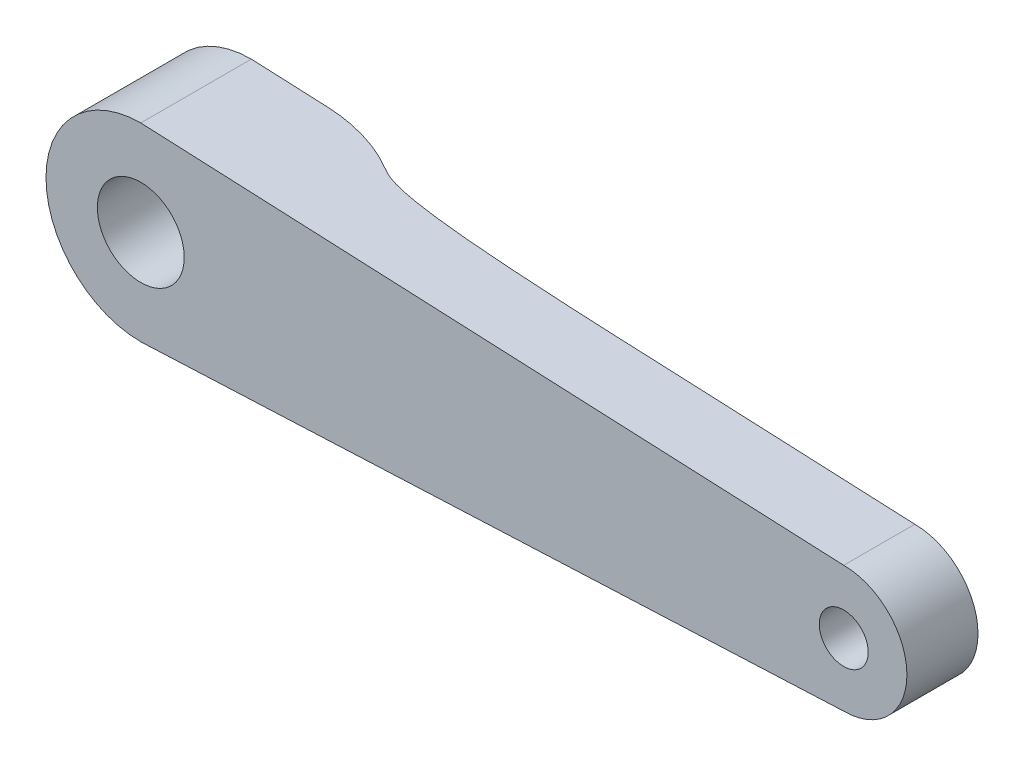
ISO-10303-21;
HEADER;
FILE_DESCRIPTION(('STEP AP214'),'2;1');
FILE_NAME('part.step','',(''),(''),'','','');
FILE_SCHEMA(('AUTOMOTIVE_DESIGN { 1 0 10303 214 1 1 1 1 }'));
ENDSEC;
DATA;
#1=APPLICATION_CONTEXT('core data for automotive mechanical design processes');
#2=APPLICATION_PROTOCOL_DEFINITION('international standard','automotive_design',2000,#1);
#3=PRODUCT_CONTEXT('',#1,'mechanical');
#4=PRODUCT('Part','Part','',(#3));
#5=PRODUCT_RELATED_PRODUCT_CATEGORY('part','',(#4));
#6=PRODUCT_DEFINITION_FORMATION('','',#4);
#7=PRODUCT_DEFINITION_CONTEXT('part definition',#1,'design');
#8=PRODUCT_DEFINITION('design','',#6,#7);
#9=PRODUCT_DEFINITION_SHAPE('','',#8);
#10=(LENGTH_UNIT() NAMED_UNIT(*) SI_UNIT(.MILLI.,.METRE.));
#11=(NAMED_UNIT(*) PLANE_ANGLE_UNIT() SI_UNIT($,.RADIAN.));
#12=(NAMED_UNIT(*) SI_UNIT($,.STERADIAN.) SOLID_ANGLE_UNIT());
#13=UNCERTAINTY_MEASURE_WITH_UNIT(LENGTH_MEASURE(1.E-05),#10,'distance_accuracy_value','');
#14=(GEOMETRIC_REPRESENTATION_CONTEXT(3) GLOBAL_UNCERTAINTY_ASSIGNED_CONTEXT((#13)) GLOBAL_UNIT_ASSIGNED_CONTEXT((#10,
#11,#12)) REPRESENTATION_CONTEXT('',''));
#15=CARTESIAN_POINT('',(0.,0.,0.));
#16=DIRECTION('',(0.,0.,1.));
#17=DIRECTION('',(1.,0.,0.));
#18=AXIS2_PLACEMENT_3D('',#15,#16,#17);
#19=CARTESIAN_POINT('',(0.269119314602494,-5.98790474990551,7.));
#20=DIRECTION('',(-0.0448984968094591,0.998991554010469,0.));
#21=DIRECTION('',(-0.998991554010469,-0.0448984968094591,0.));
#22=AXIS2_PLACEMENT_3D('',#19,#20,#21);
#23=PLANE('',#22);
#24=DIRECTION('',(0.998991554010469,0.0448984968094592,0.));
#25=VECTOR('',#24,1.);
#26=CARTESIAN_POINT('',(0.269119314602494,-5.98790474990551,0.));
#27=LINE('',#26,#25);
#28=CARTESIAN_POINT('',(0.,-6.,0.));
#29=VERTEX_POINT('',#28);
#30=CARTESIAN_POINT('',(4.83224619586164,-5.78282039569161,0.));
#31=VERTEX_POINT('',#30);
#32=EDGE_CURVE('E209',#29,#31,#27,.T.);
#33=ORIENTED_EDGE('',*,*,#32,.T.);
#34=CARTESIAN_POINT('',(4.83224619586164,-5.78282039569161,10.));
#35=DIRECTION('',(-0.0448984968094591,0.998991554010469,0.));
#36=DIRECTION('',(0.998991554010469,0.0448984968094591,0.));
#37=AXIS2_PLACEMENT_3D('',#34,#35,#36);
#38=ELLIPSE('',#37,10.0100946397943,10.);
#39=CARTESIAN_POINT('',(9.92616284542109,-5.55388032155411,1.39465206006515));
#40=VERTEX_POINT('',#39);
#41=EDGE_CURVE('E62',#31,#40,#38,.F.);
#42=ORIENTED_EDGE('',*,*,#41,.T.);
#43=CARTESIAN_POINT('',(9.,-5.59550561797753,0.));
#44=CARTESIAN_POINT('',(9.0197236961108,-5.59461915972536,0.0464110950098341));
#45=CARTESIAN_POINT('',(9.03856608160202,-5.59377231093924,0.0931738483475077));
#46=CARTESIAN_POINT('',(9.07539874100431,-5.59211691051666,0.187406937910348));
#47=CARTESIAN_POINT('',(9.09338229795599,-5.59130866076602,0.234879926602944));
#48=CARTESIAN_POINT('',(9.12921614697412,-5.58969815069779,0.330044521995679));
#49=CARTESIAN_POINT('',(9.14706583393983,-5.58889591757574,0.377736344016202));
#50=CARTESIAN_POINT('',(9.18410247172186,-5.58723134958554,0.473986394272832));
#51=CARTESIAN_POINT('',(9.20331176343384,-5.58636801063219,0.522536249827667));
#52=CARTESIAN_POINT('',(9.24385750871294,-5.58454572994549,0.618588504891965));
#53=CARTESIAN_POINT('',(9.2651874563837,-5.58358708061197,0.666093593449808));
#54=CARTESIAN_POINT('',(9.31120238889283,-5.58151899375763,0.759378646526527));
#55=CARTESIAN_POINT('',(9.33588080052951,-5.5804098516616,0.805161771891768));
#56=CARTESIAN_POINT('',(9.3793077403341,-5.57845807908611,0.87731978617561));
#57=CARTESIAN_POINT('',(9.39676060832497,-5.57767368052472,0.904476152397463));
#58=CARTESIAN_POINT('',(9.43339893405827,-5.57602701419963,0.957631817315344));
#59=CARTESIAN_POINT('',(9.45258589567841,-5.57516467884592,0.983630081919395));
#60=CARTESIAN_POINT('',(9.49267192828292,-5.57336305940302,1.03426553257482));
#61=CARTESIAN_POINT('',(9.51357082697932,-5.57242378305711,1.05890285517348));
#62=CARTESIAN_POINT('',(9.55671679037795,-5.5704846386347,1.10640426568289));
#63=CARTESIAN_POINT('',(9.57894378721268,-5.56948567248483,1.1292866386958));
#64=CARTESIAN_POINT('',(9.62483083420657,-5.56742333329409,1.17356652293696));
#65=CARTESIAN_POINT('',(9.64849105638532,-5.56635995252201,1.19496385526266));
#66=CARTESIAN_POINT('',(9.69706230096039,-5.56417697523774,1.23628019657253));
#67=CARTESIAN_POINT('',(9.72197340087065,-5.56305737524177,1.2561991137528));
#68=CARTESIAN_POINT('',(9.79918101844689,-5.55958736995744,1.31447617522593));
#69=CARTESIAN_POINT('',(9.85316460698408,-5.55716114125914,1.35060820025465));
#70=CARTESIAN_POINT('',(9.96419026942951,-5.55217122384587,1.4177709648512));
#71=CARTESIAN_POINT('',(10.0212343894077,-5.54960744317269,1.44879823391296));
#72=CARTESIAN_POINT('',(10.1381380705169,-5.54435334514531,1.50701729104118));
#73=CARTESIAN_POINT('',(10.1980244258772,-5.54166182355608,1.53415454928966));
#74=CARTESIAN_POINT('',(10.3192200730239,-5.5362148281787,1.58491677180607));
#75=CARTESIAN_POINT('',(10.3805288720795,-5.53345937653575,1.60854293191341));
#76=CARTESIAN_POINT('',(10.5183068780731,-5.52726710660346,1.65804451844934));
#77=CARTESIAN_POINT('',(10.5950334610544,-5.52381872085149,1.68319653668897));
#78=CARTESIAN_POINT('',(10.7495106387791,-5.51687592634701,1.73015459224607));
#79=CARTESIAN_POINT('',(10.8272615344642,-5.51338150406903,1.75195962129346));
#80=CARTESIAN_POINT('',(10.9836083211613,-5.506354682195,1.79293558842061));
#81=CARTESIAN_POINT('',(11.0622055610689,-5.50282222197443,1.81210132314357));
#82=CARTESIAN_POINT('',(11.2199015508644,-5.4957347617589,1.84825314694667));
#83=CARTESIAN_POINT('',(11.2990003485809,-5.49217975961434,1.86523902477332));
#84=CARTESIAN_POINT('',(11.5370015227225,-5.48148307763045,1.91355413212303));
#85=CARTESIAN_POINT('',(11.696446581161,-5.47431700758827,1.94220026094863));
#86=CARTESIAN_POINT('',(12.0160550328165,-5.45995258279477,1.99442393157232));
#87=CARTESIAN_POINT('',(12.1762180363545,-5.4527542455571,2.01800394671231));
#88=CARTESIAN_POINT('',(12.4968041556466,-5.4383458806451,2.06135742149571));
#89=CARTESIAN_POINT('',(12.6572265054988,-5.43113588739331,2.08113661507716));
#90=CARTESIAN_POINT('',(12.9783217731553,-5.41670463940875,2.11777850032749));
#91=CARTESIAN_POINT('',(13.138994538364,-5.4094833915342,2.13464255398597));
#92=CARTESIAN_POINT('',(13.5379181261682,-5.39155424152053,2.17362859752155));
#93=CARTESIAN_POINT('',(13.7763021963195,-5.38084035072722,2.194376776026));
#94=CARTESIAN_POINT('',(14.2533687368337,-5.35939915789512,2.23213792426364));
#95=CARTESIAN_POINT('',(14.4920512205215,-5.34867185525746,2.24915072074234));
#96=CARTESIAN_POINT('',(14.9697396920707,-5.32720271046874,2.28029762025646));
#97=CARTESIAN_POINT('',(15.2087457871137,-5.31646086350051,2.29443005757518));
#98=CARTESIAN_POINT('',(15.6868836383937,-5.29497152186995,2.32039488036477));
#99=CARTESIAN_POINT('',(15.9260153961614,-5.28422402713882,2.33222723713315));
#100=CARTESIAN_POINT('',(16.6422512975503,-5.2520336495483,2.36488474999077));
#101=CARTESIAN_POINT('',(17.1194807027153,-5.23058513695662,2.38294886693849));
#102=CARTESIAN_POINT('',(18.0739894118856,-5.18768586912874,2.41394764347585));
#103=CARTESIAN_POINT('',(18.55126868097,-5.16623511546203,2.42688344723063));
#104=CARTESIAN_POINT('',(19.5539639219039,-5.12117016081331,2.45007431844182));
#105=CARTESIAN_POINT('',(20.0793889781982,-5.09755555154166,2.45992843270219));
#106=CARTESIAN_POINT('',(21.1303347264904,-5.05032203476448,2.47620886283438));
#107=CARTESIAN_POINT('',(21.6558554228272,-5.02670312706395,2.48263488363882));
#108=CARTESIAN_POINT('',(22.706950291218,-4.97946290825987,2.49282830876571));
#109=CARTESIAN_POINT('',(23.2325244646253,-4.9558415970955,2.49659556811273));
#110=CARTESIAN_POINT('',(24.2850214612836,-4.90853836129063,2.50202088129101));
#111=CARTESIAN_POINT('',(24.811944310678,-4.88485643547515,2.50367353956502));
#112=CARTESIAN_POINT('',(25.8657599593421,-4.8374939344116,2.50525436943824));
#113=CARTESIAN_POINT('',(26.3926527584816,-4.81381335916937,2.5051826463527));
#114=CARTESIAN_POINT('',(27.4463647361164,-4.76645551747792,2.50359962789058));
#115=CARTESIAN_POINT('',(27.9731839148872,-4.74277825101631,2.50208852811706));
#116=CARTESIAN_POINT('',(28.5,-4.71910112359551,2.5));
#117=B_SPLINE_CURVE_WITH_KNOTS('',3,(#43,#44,#45,#46,#47,#48,#49,#50,#51,#52,#53,#54,#55,#56,
#57,#58,#59,#60,#61,#62,#63,#64,#65,#66,#67,#68,#69,#70,#71,#72,#73,#74,#75,#76,#77,#78,#79,#80,
#81,#82,#83,#84,#85,#86,#87,#88,#89,#90,#91,#92,#93,#94,#95,#96,#97,#98,#99,#100,#101,#102,#103,
#104,#105,#106,#107,#108,#109,#110,#111,#112,#113,#114,#115,#116),.UNSPECIFIED.,.F.,.F.,(4,2,2,
2,2,2,2,2,2,2,2,2,2,2,2,2,2,2,2,2,2,2,2,2,2,2,2,2,2,2,2,2,2,2,2,2,4),(0.,0.151270301755634,
0.303576241413847,0.456366182702525,0.612998456706788,0.769164220330555,0.92502774229721,
1.02184029168505,1.11873762167671,1.21562521195143,1.31130428022025,1.40699485499084,
1.50269136681471,1.697320615909,1.89208164319371,2.08935041813252,2.28655185086498,
2.52890115312104,2.77132331967133,3.01421677986102,3.25713376150387,3.74346897200961,
4.22956620513448,4.71492425121079,5.20005491544597,5.9185862623827,6.6371509292036,
7.35612997145232,8.07511798520021,9.50922952077278,10.9430209150012,12.5211483535095,
14.0994116047826,15.6777609080511,17.2601295045075,18.8424014592688,20.4244584229967),.UNSPECIFIED.);
#118=CARTESIAN_POINT('',(28.5,-4.71910112359551,2.5));
#119=VERTEX_POINT('',#118);
#120=EDGE_CURVE('E95',#40,#119,#117,.T.);
#121=ORIENTED_EDGE('',*,*,#120,.T.);
#122=DIRECTION('',(0.998991554010469,0.0448984968094591,0.));
#123=VECTOR('',#122,1.);
#124=CARTESIAN_POINT('',(0.269119314602493,-5.98790474990551,2.50000000000001));
#125=LINE('',#124,#123);
#126=CARTESIAN_POINT('',(44.5,-4.00000000000001,2.5));
#127=VERTEX_POINT('',#126);
#128=EDGE_CURVE('E98',#119,#127,#125,.T.);
#129=ORIENTED_EDGE('',*,*,#128,.T.);
#130=DIRECTION('',(0.,0.,-1.));
#131=VECTOR('',#130,1.);
#132=CARTESIAN_POINT('',(44.5,-4.00000000000001,7.));
#133=LINE('',#132,#131);
#134=CARTESIAN_POINT('',(44.5,-4.00000000000001,7.));
#135=VERTEX_POINT('',#134);
#136=EDGE_CURVE('E183',#135,#127,#133,.T.);
#137=ORIENTED_EDGE('',*,*,#136,.F.);
#138=DIRECTION('',(0.998991554010469,0.0448984968094592,0.));
#139=VECTOR('',#138,1.);
#140=CARTESIAN_POINT('',(0.269119314602494,-5.98790474990551,7.));
#141=LINE('',#140,#139);
#142=CARTESIAN_POINT('',(0.,-6.,7.));
#143=VERTEX_POINT('',#142);
#144=EDGE_CURVE('E227',#143,#135,#141,.T.);
#145=ORIENTED_EDGE('',*,*,#144,.F.);
#146=DIRECTION('',(0.,0.,-1.));
#147=VECTOR('',#146,1.);
#148=CARTESIAN_POINT('',(0.,-6.,7.));
#149=LINE('',#148,#147);
#150=EDGE_CURVE('E192',#143,#29,#149,.T.);
#151=ORIENTED_EDGE('',*,*,#150,.T.);
#152=EDGE_LOOP('',(#33,#42,#121,#129,#137,#145,#151));
#153=FACE_BOUND('',#152,.T.);
#154=ADVANCED_FACE('F40',(#153),#23,.F.);
#155=CARTESIAN_POINT('',(44.5,0.,7.));
#156=DIRECTION('',(0.,0.,-1.));
#157=DIRECTION('',(-1.,0.,0.));
#158=AXIS2_PLACEMENT_3D('',#155,#156,#157);
#159=CYLINDRICAL_SURFACE('',#158,4.00000000000001);
#160=CARTESIAN_POINT('',(44.5,0.,2.5));
#161=DIRECTION('',(0.,0.,1.));
#162=DIRECTION('',(1.,0.,0.));
#163=AXIS2_PLACEMENT_3D('',#160,#161,#162);
#164=CIRCLE('',#163,4.00000000000001);
#165=CARTESIAN_POINT('',(44.5,4.00000000000001,2.5));
#166=VERTEX_POINT('',#165);
#167=EDGE_CURVE('E110',#127,#166,#164,.T.);
#168=ORIENTED_EDGE('',*,*,#167,.T.);
#169=DIRECTION('',(0.,0.,-1.));
#170=VECTOR('',#169,1.);
#171=CARTESIAN_POINT('',(44.5,4.00000000000001,7.));
#172=LINE('',#171,#170);
#173=CARTESIAN_POINT('',(44.5,4.00000000000001,7.));
#174=VERTEX_POINT('',#173);
#175=EDGE_CURVE('E181',#174,#166,#172,.T.);
#176=ORIENTED_EDGE('',*,*,#175,.F.);
#177=CARTESIAN_POINT('',(44.5,0.,7.));
#178=DIRECTION('',(0.,0.,1.));
#179=DIRECTION('',(1.,0.,0.));
#180=AXIS2_PLACEMENT_3D('',#177,#178,#179);
#181=CIRCLE('',#180,4.00000000000001);
#182=EDGE_CURVE('E235',#135,#174,#181,.T.);
#183=ORIENTED_EDGE('',*,*,#182,.F.);
#184=ORIENTED_EDGE('',*,*,#136,.T.);
#185=EDGE_LOOP('',(#168,#176,#183,#184));
#186=FACE_BOUND('',#185,.T.);
#187=ADVANCED_FACE('F169',(#186),#159,.T.);
#188=CARTESIAN_POINT('',(0.269119314602494,5.98790474990551,7.));
#189=DIRECTION('',(0.0448984968094591,0.998991554010469,0.));
#190=DIRECTION('',(-0.998991554010469,0.0448984968094591,0.));
#191=AXIS2_PLACEMENT_3D('',#188,#189,#190);
#192=PLANE('',#191);
#193=CARTESIAN_POINT('',(9.,5.59550561797753,0.));
#194=CARTESIAN_POINT('',(9.0197236961108,5.59461915972536,0.0464110950098343));
#195=CARTESIAN_POINT('',(9.03856608160202,5.59377231093924,0.093173848347508));
#196=CARTESIAN_POINT('',(9.07539874100431,5.59211691051666,0.187406937910348));
#197=CARTESIAN_POINT('',(9.09338229795599,5.59130866076602,0.234879926602944));
#198=CARTESIAN_POINT('',(9.12921614697412,5.58969815069779,0.330044521995679));
#199=CARTESIAN_POINT('',(9.14706583393983,5.58889591757574,0.377736344016202));
#200=CARTESIAN_POINT('',(9.18410247172186,5.58723134958554,0.473986394272832));
#201=CARTESIAN_POINT('',(9.20331176343384,5.58636801063219,0.522536249827666));
#202=CARTESIAN_POINT('',(9.24385750871294,5.58454572994549,0.618588504891964));
#203=CARTESIAN_POINT('',(9.2651874563837,5.58358708061197,0.666093593449808));
#204=CARTESIAN_POINT('',(9.31120238889283,5.58151899375763,0.759378646526527));
#205=CARTESIAN_POINT('',(9.3358808005295,5.5804098516616,0.805161771891768));
#206=CARTESIAN_POINT('',(9.3793077403341,5.57845807908611,0.87731978617561));
#207=CARTESIAN_POINT('',(9.39676060832497,5.57767368052472,0.904476152397463));
#208=CARTESIAN_POINT('',(9.43339893405828,5.57602701419963,0.957631817315344));
#209=CARTESIAN_POINT('',(9.45258589567841,5.57516467884592,0.983630081919393));
#210=CARTESIAN_POINT('',(9.49267192828292,5.57336305940302,1.03426553257482));
#211=CARTESIAN_POINT('',(9.51357082697932,5.57242378305711,1.05890285517348));
#212=CARTESIAN_POINT('',(9.55671679037795,5.5704846386347,1.1064042656829));
#213=CARTESIAN_POINT('',(9.57894378721268,5.56948567248483,1.1292866386958));
#214=CARTESIAN_POINT('',(9.62483083420658,5.56742333329409,1.17356652293696));
#215=CARTESIAN_POINT('',(9.64849105638532,5.56635995252201,1.19496385526266));
#216=CARTESIAN_POINT('',(9.6970623009604,5.56417697523774,1.23628019657252));
#217=CARTESIAN_POINT('',(9.72197340087065,5.56305737524177,1.2561991137528));
#218=CARTESIAN_POINT('',(9.79918101844689,5.55958736995744,1.31447617522593));
#219=CARTESIAN_POINT('',(9.85316460698408,5.55716114125914,1.35060820025465));
#220=CARTESIAN_POINT('',(9.96419026942951,5.55217122384587,1.4177709648512));
#221=CARTESIAN_POINT('',(10.0212343894077,5.54960744317269,1.44879823391296));
#222=CARTESIAN_POINT('',(10.1381380705169,5.54435334514531,1.50701729104118));
#223=CARTESIAN_POINT('',(10.1980244258772,5.54166182355608,1.53415454928966));
#224=CARTESIAN_POINT('',(10.3192200730239,5.5362148281787,1.58491677180607));
#225=CARTESIAN_POINT('',(10.3805288720795,5.53345937653575,1.60854293191341));
#226=CARTESIAN_POINT('',(10.5183068780731,5.52726710660346,1.65804451844934));
#227=CARTESIAN_POINT('',(10.5950334610544,5.52381872085149,1.68319653668897));
#228=CARTESIAN_POINT('',(10.7495106387791,5.51687592634701,1.73015459224607));
#229=CARTESIAN_POINT('',(10.8272615344642,5.51338150406903,1.75195962129345));
#230=CARTESIAN_POINT('',(10.9836083211613,5.506354682195,1.79293558842061));
#231=CARTESIAN_POINT('',(11.0622055610689,5.50282222197443,1.81210132314357));
#232=CARTESIAN_POINT('',(11.2199015508644,5.4957347617589,1.84825314694666));
#233=CARTESIAN_POINT('',(11.2990003485809,5.49217975961434,1.86523902477332));
#234=CARTESIAN_POINT('',(11.5370015227225,5.48148307763045,1.91355413212303));
#235=CARTESIAN_POINT('',(11.696446581161,5.47431700758827,1.94220026094863));
#236=CARTESIAN_POINT('',(12.0160550328165,5.45995258279477,1.99442393157232));
#237=CARTESIAN_POINT('',(12.1762180363545,5.4527542455571,2.0180039467123));
#238=CARTESIAN_POINT('',(12.4968041556466,5.4383458806451,2.06135742149571));
#239=CARTESIAN_POINT('',(12.6572265054988,5.43113588739331,2.08113661507716));
#240=CARTESIAN_POINT('',(12.9783217731553,5.41670463940875,2.11777850032749));
#241=CARTESIAN_POINT('',(13.138994538364,5.40948339153421,2.13464255398597));
#242=CARTESIAN_POINT('',(13.5379181261682,5.39155424152053,2.17362859752155));
#243=CARTESIAN_POINT('',(13.7763021963195,5.38084035072722,2.194376776026));
#244=CARTESIAN_POINT('',(14.2533687368337,5.35939915789512,2.23213792426364));
#245=CARTESIAN_POINT('',(14.4920512205215,5.34867185525746,2.24915072074234));
#246=CARTESIAN_POINT('',(14.9697396920706,5.32720271046874,2.28029762025646));
#247=CARTESIAN_POINT('',(15.2087457871137,5.31646086350051,2.29443005757518));
#248=CARTESIAN_POINT('',(15.6868836383936,5.29497152186995,2.32039488036477));
#249=CARTESIAN_POINT('',(15.9260153961614,5.28422402713882,2.33222723713315));
#250=CARTESIAN_POINT('',(16.6422512975503,5.2520336495483,2.36488474999077));
#251=CARTESIAN_POINT('',(17.1194807027153,5.23058513695662,2.38294886693848));
#252=CARTESIAN_POINT('',(18.0739894118856,5.18768586912874,2.41394764347585));
#253=CARTESIAN_POINT('',(18.5512686809699,5.16623511546203,2.42688344723062));
#254=CARTESIAN_POINT('',(19.5539639219039,5.12117016081331,2.45007431844182));
#255=CARTESIAN_POINT('',(20.0793889781982,5.09755555154166,2.45992843270219));
#256=CARTESIAN_POINT('',(21.1303347264904,5.05032203476448,2.47620886283438));
#257=CARTESIAN_POINT('',(21.6558554228272,5.02670312706395,2.48263488363882));
#258=CARTESIAN_POINT('',(22.706950291218,4.97946290825987,2.49282830876571));
#259=CARTESIAN_POINT('',(23.2325244646253,4.9558415970955,2.49659556811273));
#260=CARTESIAN_POINT('',(24.2850214612836,4.90853836129063,2.50202088129101));
#261=CARTESIAN_POINT('',(24.811944310678,4.88485643547515,2.50367353956502));
#262=CARTESIAN_POINT('',(25.8657599593421,4.83749393441159,2.50525436943824));
#263=CARTESIAN_POINT('',(26.3926527584816,4.81381335916937,2.5051826463527));
#264=CARTESIAN_POINT('',(27.4463647361164,4.76645551747792,2.50359962789058));
#265=CARTESIAN_POINT('',(27.9731839148872,4.74277825101631,2.50208852811706));
#266=CARTESIAN_POINT('',(28.5,4.71910112359551,2.5));
#267=B_SPLINE_CURVE_WITH_KNOTS('',3,(#193,#194,#195,#196,#197,#198,#199,#200,#201,#202,#203,
#204,#205,#206,#207,#208,#209,#210,#211,#212,#213,#214,#215,#216,#217,#218,#219,#220,#221,#222,
#223,#224,#225,#226,#227,#228,#229,#230,#231,#232,#233,#234,#235,#236,#237,#238,#239,#240,#241,
#242,#243,#244,#245,#246,#247,#248,#249,#250,#251,#252,#253,#254,#255,#256,#257,#258,#259,#260,
#261,#262,#263,#264,#265,#266),.UNSPECIFIED.,.F.,.F.,(4,2,2,2,2,2,2,2,2,2,2,2,2,2,2,2,2,2,2,2,2,
2,2,2,2,2,2,2,2,2,2,2,2,2,2,2,4),(0.,0.151270301755635,0.303576241413847,0.456366182702525,
0.612998456706788,0.769164220330554,0.92502774229721,1.02184029168505,1.11873762167671,
1.21562521195143,1.31130428022025,1.40699485499084,1.50269136681471,1.697320615909,
1.89208164319371,2.08935041813252,2.28655185086498,2.52890115312104,2.77132331967133,
3.01421677986101,3.25713376150387,3.7434689720096,4.22956620513448,4.71492425121078,
5.20005491544596,5.91858626238269,6.63715092920359,7.3561299714523,8.0751179852002,
9.50922952077275,10.9430209150011,12.5211483535095,14.0994116047826,15.6777609080511,
17.2601295045075,18.8424014592687,20.4244584229967),.UNSPECIFIED.);
#268=CARTESIAN_POINT('',(9.92616284542109,5.55388032155411,1.39465206006515));
#269=VERTEX_POINT('',#268);
#270=CARTESIAN_POINT('',(28.5,4.71910112359551,2.5));
#271=VERTEX_POINT('',#270);
#272=EDGE_CURVE('E102',#269,#271,#267,.T.);
#273=ORIENTED_EDGE('',*,*,#272,.F.);
#274=CARTESIAN_POINT('',(4.83224619586164,5.78282039569161,10.));
#275=DIRECTION('',(0.0448984968094591,0.998991554010469,0.));
#276=DIRECTION('',(-0.998991554010469,0.0448984968094591,0.));
#277=AXIS2_PLACEMENT_3D('',#274,#275,#276);
#278=ELLIPSE('',#277,10.0100946397943,10.);
#279=CARTESIAN_POINT('',(4.83224619586164,5.78282039569161,0.));
#280=VERTEX_POINT('',#279);
#281=EDGE_CURVE('E11',#269,#280,#278,.T.);
#282=ORIENTED_EDGE('',*,*,#281,.T.);
#283=DIRECTION('',(0.998991554010469,-0.0448984968094592,0.));
#284=VECTOR('',#283,1.);
#285=CARTESIAN_POINT('',(0.269119314602494,5.98790474990551,0.));
#286=LINE('',#285,#284);
#287=CARTESIAN_POINT('',(0.,6.,0.));
#288=VERTEX_POINT('',#287);
#289=EDGE_CURVE('E211',#288,#280,#286,.T.);
#290=ORIENTED_EDGE('',*,*,#289,.F.);
#291=DIRECTION('',(0.,0.,-1.));
#292=VECTOR('',#291,1.);
#293=CARTESIAN_POINT('',(0.,6.,7.));
#294=LINE('',#293,#292);
#295=CARTESIAN_POINT('',(0.,6.,7.));
#296=VERTEX_POINT('',#295);
#297=EDGE_CURVE('E188',#296,#288,#294,.T.);
#298=ORIENTED_EDGE('',*,*,#297,.F.);
#299=DIRECTION('',(0.998991554010469,-0.0448984968094592,0.));
#300=VECTOR('',#299,1.);
#301=CARTESIAN_POINT('',(0.269119314602494,5.98790474990551,7.));
#302=LINE('',#301,#300);
#303=EDGE_CURVE('E187',#296,#174,#302,.T.);
#304=ORIENTED_EDGE('',*,*,#303,.T.);
#305=ORIENTED_EDGE('',*,*,#175,.T.);
#306=DIRECTION('',(0.998991554010469,-0.0448984968094591,0.));
#307=VECTOR('',#306,1.);
#308=CARTESIAN_POINT('',(0.269119314602493,5.98790474990551,2.50000000000001));
#309=LINE('',#308,#307);
#310=EDGE_CURVE('E184',#271,#166,#309,.T.);
#311=ORIENTED_EDGE('',*,*,#310,.F.);
#312=EDGE_LOOP('',(#273,#282,#290,#298,#304,#305,#311));
#313=FACE_BOUND('',#312,.T.);
#314=ADVANCED_FACE('F131',(#313),#192,.T.);
#315=CARTESIAN_POINT('',(0.,0.,7.));
#316=DIRECTION('',(0.,0.,-1.));
#317=DIRECTION('',(-1.,0.,0.));
#318=AXIS2_PLACEMENT_3D('',#315,#316,#317);
#319=CYLINDRICAL_SURFACE('',#318,6.);
#320=CARTESIAN_POINT('',(0.,0.,0.));
#321=DIRECTION('',(0.,0.,1.));
#322=DIRECTION('',(1.,0.,0.));
#323=AXIS2_PLACEMENT_3D('',#320,#321,#322);
#324=CIRCLE('',#323,6.);
#325=EDGE_CURVE('E219',#288,#29,#324,.T.);
#326=ORIENTED_EDGE('',*,*,#325,.T.);
#327=ORIENTED_EDGE('',*,*,#150,.F.);
#328=CARTESIAN_POINT('',(0.,0.,7.));
#329=DIRECTION('',(0.,0.,1.));
#330=DIRECTION('',(1.,0.,0.));
#331=AXIS2_PLACEMENT_3D('',#328,#329,#330);
#332=CIRCLE('',#331,6.);
#333=EDGE_CURVE('E229',#296,#143,#332,.T.);
#334=ORIENTED_EDGE('',*,*,#333,.F.);
#335=ORIENTED_EDGE('',*,*,#297,.T.);
#336=EDGE_LOOP('',(#326,#327,#334,#335));
#337=FACE_BOUND('',#336,.T.);
#338=ADVANCED_FACE('F162',(#337),#319,.T.);
#339=CARTESIAN_POINT('',(44.5,0.,7.));
#340=DIRECTION('',(0.,0.,-1.));
#341=DIRECTION('',(-1.,0.,0.));
#342=AXIS2_PLACEMENT_3D('',#339,#340,#341);
#343=CYLINDRICAL_SURFACE('',#342,1.55);
#344=CARTESIAN_POINT('',(44.5,0.,2.5));
#345=DIRECTION('',(0.,0.,1.));
#346=DIRECTION('',(1.,0.,0.));
#347=AXIS2_PLACEMENT_3D('',#344,#345,#346);
#348=CIRCLE('',#347,1.55);
#349=CARTESIAN_POINT('',(46.05,0.,2.5));
#350=VERTEX_POINT('',#349);
#351=EDGE_CURVE('E101',#350,#350,#348,.T.);
#352=ORIENTED_EDGE('',*,*,#351,.F.);
#353=EDGE_LOOP('',(#352));
#354=FACE_BOUND('',#353,.T.);
#355=CARTESIAN_POINT('',(44.5,0.,7.));
#356=DIRECTION('',(0.,0.,1.));
#357=DIRECTION('',(1.,0.,0.));
#358=AXIS2_PLACEMENT_3D('',#355,#356,#357);
#359=CIRCLE('',#358,1.55);
#360=CARTESIAN_POINT('',(46.05,0.,7.));
#361=VERTEX_POINT('',#360);
#362=EDGE_CURVE('E224',#361,#361,#359,.T.);
#363=ORIENTED_EDGE('',*,*,#362,.T.);
#364=EDGE_LOOP('',(#363));
#365=FACE_BOUND('',#364,.T.);
#366=ADVANCED_FACE('F156',(#354,#365),#343,.F.);
#367=CARTESIAN_POINT('',(0.,0.,7.));
#368=DIRECTION('',(0.,0.,1.));
#369=DIRECTION('',(1.,0.,0.));
#370=AXIS2_PLACEMENT_3D('',#367,#368,#369);
#371=PLANE('',#370);
#372=CARTESIAN_POINT('',(0.,0.,7.));
#373=DIRECTION('',(0.,0.,1.));
#374=DIRECTION('',(1.,0.,0.));
#375=AXIS2_PLACEMENT_3D('',#372,#373,#374);
#376=CIRCLE('',#375,2.75);
#377=CARTESIAN_POINT('',(2.75,0.,7.));
#378=VERTEX_POINT('',#377);
#379=EDGE_CURVE('E199',#378,#378,#376,.T.);
#380=ORIENTED_EDGE('',*,*,#379,.F.);
#381=EDGE_LOOP('',(#380));
#382=FACE_BOUND('',#381,.T.);
#383=ORIENTED_EDGE('',*,*,#144,.T.);
#384=ORIENTED_EDGE('',*,*,#182,.T.);
#385=ORIENTED_EDGE('',*,*,#303,.F.);
#386=ORIENTED_EDGE('',*,*,#333,.T.);
#387=EDGE_LOOP('',(#383,#384,#385,#386));
#388=FACE_BOUND('',#387,.T.);
#389=ORIENTED_EDGE('',*,*,#362,.F.);
#390=EDGE_LOOP('',(#389));
#391=FACE_BOUND('',#390,.T.);
#392=ADVANCED_FACE('F153',(#382,#388,#391),#371,.T.);
#393=CARTESIAN_POINT('',(0.,0.,0.));
#394=DIRECTION('',(0.,0.,1.));
#395=DIRECTION('',(1.,0.,0.));
#396=AXIS2_PLACEMENT_3D('',#393,#394,#395);
#397=PLANE('',#396);
#398=CARTESIAN_POINT('',(0.,0.,0.));
#399=DIRECTION('',(0.,0.,-1.));
#400=DIRECTION('',(-1.,0.,0.));
#401=AXIS2_PLACEMENT_3D('',#398,#399,#400);
#402=CIRCLE('',#401,1.75);
#403=CARTESIAN_POINT('',(-1.75,0.,0.));
#404=VERTEX_POINT('',#403);
#405=EDGE_CURVE('E111',#404,#404,#402,.T.);
#406=ORIENTED_EDGE('',*,*,#405,.F.);
#407=EDGE_LOOP('',(#406));
#408=FACE_BOUND('',#407,.T.);
#409=ORIENTED_EDGE('',*,*,#289,.T.);
#410=DIRECTION('',(0.,1.,0.));
#411=VECTOR('',#410,1.);
#412=CARTESIAN_POINT('',(4.83224619586164,0.,0.));
#413=LINE('',#412,#411);
#414=EDGE_CURVE('E190',#280,#31,#413,.F.);
#415=ORIENTED_EDGE('',*,*,#414,.T.);
#416=ORIENTED_EDGE('',*,*,#32,.F.);
#417=ORIENTED_EDGE('',*,*,#325,.F.);
#418=EDGE_LOOP('',(#409,#415,#416,#417));
#419=FACE_BOUND('',#418,.T.);
#420=ADVANCED_FACE('F151',(#408,#419),#397,.F.);
#421=CARTESIAN_POINT('',(0.,0.,2.));
#422=DIRECTION('',(0.,0.,1.));
#423=DIRECTION('',(1.,0.,0.));
#424=AXIS2_PLACEMENT_3D('',#421,#422,#423);
#425=CYLINDRICAL_SURFACE('',#424,2.75);
#426=CARTESIAN_POINT('',(0.,0.,2.));
#427=DIRECTION('',(0.,0.,1.));
#428=DIRECTION('',(1.,0.,0.));
#429=AXIS2_PLACEMENT_3D('',#426,#427,#428);
#430=CIRCLE('',#429,2.75);
#431=CARTESIAN_POINT('',(2.75,0.,2.));
#432=VERTEX_POINT('',#431);
#433=EDGE_CURVE('E217',#432,#432,#430,.T.);
#434=ORIENTED_EDGE('',*,*,#433,.F.);
#435=EDGE_LOOP('',(#434));
#436=FACE_BOUND('',#435,.T.);
#437=ORIENTED_EDGE('',*,*,#379,.T.);
#438=EDGE_LOOP('',(#437));
#439=FACE_BOUND('',#438,.T.);
#440=ADVANCED_FACE('F147',(#436,#439),#425,.F.);
#441=CARTESIAN_POINT('',(0.,0.,2.));
#442=DIRECTION('',(0.,0.,1.));
#443=DIRECTION('',(1.,0.,0.));
#444=AXIS2_PLACEMENT_3D('',#441,#442,#443);
#445=PLANE('',#444);
#446=CARTESIAN_POINT('',(0.,0.,2.));
#447=DIRECTION('',(0.,0.,1.));
#448=DIRECTION('',(1.,0.,0.));
#449=AXIS2_PLACEMENT_3D('',#446,#447,#448);
#450=CIRCLE('',#449,1.75);
#451=CARTESIAN_POINT('',(1.75,0.,2.));
#452=VERTEX_POINT('',#451);
#453=EDGE_CURVE('E196',#452,#452,#450,.T.);
#454=ORIENTED_EDGE('',*,*,#453,.F.);
#455=EDGE_LOOP('',(#454));
#456=FACE_BOUND('',#455,.T.);
#457=ORIENTED_EDGE('',*,*,#433,.T.);
#458=EDGE_LOOP('',(#457));
#459=FACE_BOUND('',#458,.T.);
#460=ADVANCED_FACE('F143',(#456,#459),#445,.T.);
#461=CARTESIAN_POINT('',(0.,0.,5.));
#462=DIRECTION('',(0.,0.,-1.));
#463=DIRECTION('',(-1.,0.,0.));
#464=AXIS2_PLACEMENT_3D('',#461,#462,#463);
#465=CYLINDRICAL_SURFACE('',#464,1.75);
#466=ORIENTED_EDGE('',*,*,#453,.T.);
#467=EDGE_LOOP('',(#466));
#468=FACE_BOUND('',#467,.T.);
#469=ORIENTED_EDGE('',*,*,#405,.T.);
#470=EDGE_LOOP('',(#469));
#471=FACE_BOUND('',#470,.T.);
#472=ADVANCED_FACE('F139',(#468,#471),#465,.F.);
#473=CARTESIAN_POINT('',(48.5,-6.,2.5));
#474=DIRECTION('',(0.,0.,1.));
#475=DIRECTION('',(1.,0.,0.));
#476=AXIS2_PLACEMENT_3D('',#473,#474,#475);
#477=PLANE('',#476);
#478=ORIENTED_EDGE('',*,*,#351,.T.);
#479=EDGE_LOOP('',(#478));
#480=FACE_BOUND('',#479,.T.);
#481=DIRECTION('',(0.,1.,0.));
#482=VECTOR('',#481,1.);
#483=CARTESIAN_POINT('',(28.5,-6.,2.5));
#484=LINE('',#483,#482);
#485=EDGE_CURVE('E108',#119,#271,#484,.T.);
#486=ORIENTED_EDGE('',*,*,#485,.T.);
#487=ORIENTED_EDGE('',*,*,#310,.T.);
#488=ORIENTED_EDGE('',*,*,#167,.F.);
#489=ORIENTED_EDGE('',*,*,#128,.F.);
#490=EDGE_LOOP('',(#486,#487,#488,#489));
#491=FACE_BOUND('',#490,.T.);
#492=ADVANCED_FACE('F106',(#480,#491),#477,.F.);
#493=CARTESIAN_POINT('',(9.,-6.,0.));
#494=CARTESIAN_POINT('',(9.73454277513629,-6.,1.73207559780652));
#495=CARTESIAN_POINT('',(8.77219140461031,-6.,2.578671178641));
#496=CARTESIAN_POINT('',(28.5,-6.,2.5));
#497=B_SPLINE_CURVE_WITH_KNOTS('',3,(#493,#494,#495,#496),.UNSPECIFIED.,.F.,.F.,(4,4),(0.,1.),.UNSPECIFIED.);
#498=DIRECTION('',(0.,1.,0.));
#499=VECTOR('',#498,1.);
#500=SURFACE_OF_LINEAR_EXTRUSION('',#497,#499);
#501=ORIENTED_EDGE('',*,*,#120,.F.);
#502=DIRECTION('',(0.,1.,0.));
#503=VECTOR('',#502,1.);
#504=CARTESIAN_POINT('',(9.92616284542109,-5.55388032155411,1.39465206006515));
#505=LINE('',#504,#503);
#506=EDGE_CURVE('E48',#40,#269,#505,.T.);
#507=ORIENTED_EDGE('',*,*,#506,.T.);
#508=ORIENTED_EDGE('',*,*,#272,.T.);
#509=ORIENTED_EDGE('',*,*,#485,.F.);
#510=EDGE_LOOP('',(#501,#507,#508,#509));
#511=FACE_BOUND('',#510,.T.);
#512=ADVANCED_FACE('F113',(#511),#500,.F.);
#513=CARTESIAN_POINT('',(4.83224619586164,5.55388032155411,10.));
#514=DIRECTION('',(0.,1.,0.));
#515=DIRECTION('',(0.,0.,1.));
#516=AXIS2_PLACEMENT_3D('',#513,#514,#515);
#517=CYLINDRICAL_SURFACE('',#516,10.);
#518=ORIENTED_EDGE('',*,*,#281,.F.);
#519=ORIENTED_EDGE('',*,*,#506,.F.);
#520=ORIENTED_EDGE('',*,*,#41,.F.);
#521=ORIENTED_EDGE('',*,*,#414,.F.);
#522=EDGE_LOOP('',(#518,#519,#520,#521));
#523=FACE_BOUND('',#522,.T.);
#524=ADVANCED_FACE('F42',(#523),#517,.T.);
#525=CLOSED_SHELL('',(#154,#187,#314,#338,#366,#392,#420,#440,#460,#472,#492,#512,#524));
#526=MANIFOLD_SOLID_BREP('B2',#525);
#527=ADVANCED_BREP_SHAPE_REPRESENTATION('',(#18,#526),#14);
#528=SHAPE_DEFINITION_REPRESENTATION(#9,#527);
ENDSEC;
END-ISO-10303-21;
